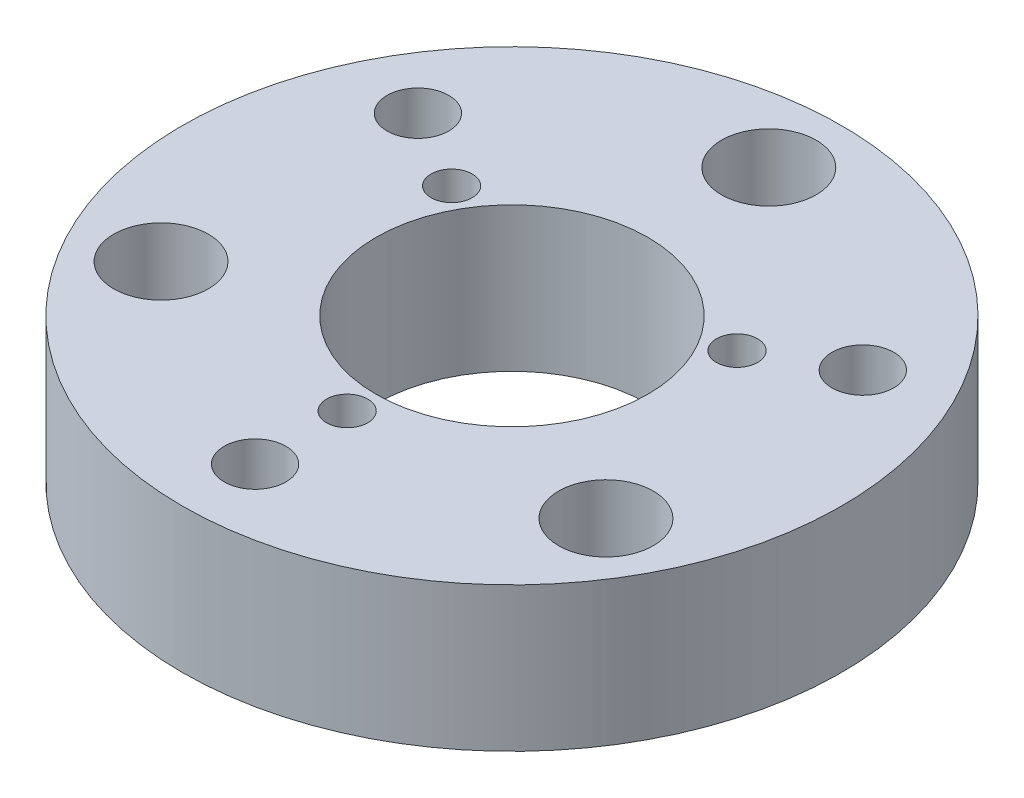
ISO-10303-21;
HEADER;
FILE_DESCRIPTION(('STEP AP214'),'2;1');
FILE_NAME('part.step','',(''),(''),'','','');
FILE_SCHEMA(('AUTOMOTIVE_DESIGN { 1 0 10303 214 1 1 1 1 }'));
ENDSEC;
DATA;
#1=APPLICATION_CONTEXT('core data for automotive mechanical design processes');
#2=APPLICATION_PROTOCOL_DEFINITION('international standard','automotive_design',2000,#1);
#3=PRODUCT_CONTEXT('',#1,'mechanical');
#4=PRODUCT('Part','Part','',(#3));
#5=PRODUCT_RELATED_PRODUCT_CATEGORY('part','',(#4));
#6=PRODUCT_DEFINITION_FORMATION('','',#4);
#7=PRODUCT_DEFINITION_CONTEXT('part definition',#1,'design');
#8=PRODUCT_DEFINITION('design','',#6,#7);
#9=PRODUCT_DEFINITION_SHAPE('','',#8);
#10=(LENGTH_UNIT() NAMED_UNIT(*) SI_UNIT(.MILLI.,.METRE.));
#11=(NAMED_UNIT(*) PLANE_ANGLE_UNIT() SI_UNIT($,.RADIAN.));
#12=(NAMED_UNIT(*) SI_UNIT($,.STERADIAN.) SOLID_ANGLE_UNIT());
#13=UNCERTAINTY_MEASURE_WITH_UNIT(LENGTH_MEASURE(1.E-05),#10,'distance_accuracy_value','');
#14=(GEOMETRIC_REPRESENTATION_CONTEXT(3) GLOBAL_UNCERTAINTY_ASSIGNED_CONTEXT((#13)) GLOBAL_UNIT_ASSIGNED_CONTEXT((#10,
#11,#12)) REPRESENTATION_CONTEXT('',''));
#15=CARTESIAN_POINT('',(0.,0.,0.));
#16=DIRECTION('',(0.,0.,1.));
#17=DIRECTION('',(1.,0.,0.));
#18=AXIS2_PLACEMENT_3D('',#15,#16,#17);
#19=CARTESIAN_POINT('',(0.,0.,24.9415316289918));
#20=DIRECTION('',(0.,1.,0.));
#21=DIRECTION('',(0.,0.,1.));
#22=AXIS2_PLACEMENT_3D('',#19,#20,#21);
#23=CYLINDRICAL_SURFACE('',#22,1.5);
#24=CARTESIAN_POINT('',(0.,7.,24.9415316289918));
#25=DIRECTION('',(0.,1.,0.));
#26=DIRECTION('',(0.,0.,1.));
#27=AXIS2_PLACEMENT_3D('',#24,#25,#26);
#28=CIRCLE('',#27,1.5);
#29=CARTESIAN_POINT('',(0.,7.,26.4415316289918));
#30=VERTEX_POINT('',#29);
#31=EDGE_CURVE('E92',#30,#30,#28,.T.);
#32=ORIENTED_EDGE('',*,*,#31,.T.);
#33=EDGE_LOOP('',(#32));
#34=FACE_BOUND('',#33,.T.);
#35=CARTESIAN_POINT('',(0.,4.,24.9415316289918));
#36=DIRECTION('',(0.,-1.,0.));
#37=DIRECTION('',(0.,0.,-1.));
#38=AXIS2_PLACEMENT_3D('',#35,#36,#37);
#39=CIRCLE('',#38,1.5);
#40=CARTESIAN_POINT('',(0.,4.,23.4415316289918));
#41=VERTEX_POINT('',#40);
#42=EDGE_CURVE('E44',#41,#41,#39,.F.);
#43=ORIENTED_EDGE('',*,*,#42,.F.);
#44=EDGE_LOOP('',(#43));
#45=FACE_BOUND('',#44,.T.);
#46=ADVANCED_FACE('F40',(#34,#45),#23,.F.);
#47=CARTESIAN_POINT('',(10.8,0.,6.23538290724796));
#48=DIRECTION('',(0.,1.,0.));
#49=DIRECTION('',(0.,0.,1.));
#50=AXIS2_PLACEMENT_3D('',#47,#48,#49);
#51=CYLINDRICAL_SURFACE('',#50,1.5);
#52=CARTESIAN_POINT('',(10.8,7.,6.23538290724796));
#53=DIRECTION('',(0.,1.,0.));
#54=DIRECTION('',(0.,0.,1.));
#55=AXIS2_PLACEMENT_3D('',#52,#53,#54);
#56=CIRCLE('',#55,1.5);
#57=CARTESIAN_POINT('',(10.8,7.,7.73538290724796));
#58=VERTEX_POINT('',#57);
#59=EDGE_CURVE('E99',#58,#58,#56,.T.);
#60=ORIENTED_EDGE('',*,*,#59,.T.);
#61=EDGE_LOOP('',(#60));
#62=FACE_BOUND('',#61,.T.);
#63=CARTESIAN_POINT('',(10.8,4.,6.23538290724796));
#64=DIRECTION('',(0.,-1.,0.));
#65=DIRECTION('',(0.,0.,-1.));
#66=AXIS2_PLACEMENT_3D('',#63,#64,#65);
#67=CIRCLE('',#66,1.5);
#68=CARTESIAN_POINT('',(10.8,4.,4.73538290724796));
#69=VERTEX_POINT('',#68);
#70=EDGE_CURVE('E81',#69,#69,#67,.F.);
#71=ORIENTED_EDGE('',*,*,#70,.F.);
#72=EDGE_LOOP('',(#71));
#73=FACE_BOUND('',#72,.T.);
#74=ADVANCED_FACE('F192',(#62,#73),#51,.F.);
#75=CARTESIAN_POINT('',(-10.8,0.,6.23538290724796));
#76=DIRECTION('',(0.,1.,0.));
#77=DIRECTION('',(0.,0.,1.));
#78=AXIS2_PLACEMENT_3D('',#75,#76,#77);
#79=CYLINDRICAL_SURFACE('',#78,1.5);
#80=CARTESIAN_POINT('',(-10.8,7.,6.23538290724796));
#81=DIRECTION('',(0.,1.,0.));
#82=DIRECTION('',(0.,0.,1.));
#83=AXIS2_PLACEMENT_3D('',#80,#81,#82);
#84=CIRCLE('',#83,1.5);
#85=CARTESIAN_POINT('',(-10.8,7.,7.73538290724796));
#86=VERTEX_POINT('',#85);
#87=EDGE_CURVE('E108',#86,#86,#84,.T.);
#88=ORIENTED_EDGE('',*,*,#87,.T.);
#89=EDGE_LOOP('',(#88));
#90=FACE_BOUND('',#89,.T.);
#91=CARTESIAN_POINT('',(-10.8,4.,6.23538290724796));
#92=DIRECTION('',(0.,-1.,0.));
#93=DIRECTION('',(0.,0.,-1.));
#94=AXIS2_PLACEMENT_3D('',#91,#92,#93);
#95=CIRCLE('',#94,1.5);
#96=CARTESIAN_POINT('',(-10.8,4.,4.73538290724796));
#97=VERTEX_POINT('',#96);
#98=EDGE_CURVE('E78',#97,#97,#95,.F.);
#99=ORIENTED_EDGE('',*,*,#98,.F.);
#100=EDGE_LOOP('',(#99));
#101=FACE_BOUND('',#100,.T.);
#102=ADVANCED_FACE('F197',(#90,#101),#79,.F.);
#103=CARTESIAN_POINT('',(-10.8,7.,18.7061487217439));
#104=DIRECTION('',(0.,-1.,0.));
#105=DIRECTION('',(0.,0.,-1.));
#106=AXIS2_PLACEMENT_3D('',#103,#104,#105);
#107=CYLINDRICAL_SURFACE('',#106,1.3);
#108=CARTESIAN_POINT('',(-10.8,0.,18.7061487217439));
#109=DIRECTION('',(0.,1.,0.));
#110=DIRECTION('',(0.,0.,1.));
#111=AXIS2_PLACEMENT_3D('',#108,#109,#110);
#112=CIRCLE('',#111,1.3);
#113=CARTESIAN_POINT('',(-10.8,0.,20.0061487217439));
#114=VERTEX_POINT('',#113);
#115=EDGE_CURVE('E161',#114,#114,#112,.T.);
#116=ORIENTED_EDGE('',*,*,#115,.F.);
#117=EDGE_LOOP('',(#116));
#118=FACE_BOUND('',#117,.T.);
#119=CARTESIAN_POINT('',(-10.8,2.,18.7061487217439));
#120=DIRECTION('',(0.,1.,0.));
#121=DIRECTION('',(0.,0.,1.));
#122=AXIS2_PLACEMENT_3D('',#119,#120,#121);
#123=CIRCLE('',#122,1.3);
#124=CARTESIAN_POINT('',(-10.8,2.,20.0061487217439));
#125=VERTEX_POINT('',#124);
#126=EDGE_CURVE('E73',#125,#125,#123,.T.);
#127=ORIENTED_EDGE('',*,*,#126,.T.);
#128=EDGE_LOOP('',(#127));
#129=FACE_BOUND('',#128,.T.);
#130=ADVANCED_FACE('F254',(#118,#129),#107,.F.);
#131=CARTESIAN_POINT('',(10.8,7.,18.7061487217439));
#132=DIRECTION('',(0.,-1.,0.));
#133=DIRECTION('',(0.,0.,-1.));
#134=AXIS2_PLACEMENT_3D('',#131,#132,#133);
#135=CYLINDRICAL_SURFACE('',#134,1.3);
#136=CARTESIAN_POINT('',(10.8,0.,18.7061487217439));
#137=DIRECTION('',(0.,1.,0.));
#138=DIRECTION('',(0.,0.,1.));
#139=AXIS2_PLACEMENT_3D('',#136,#137,#138);
#140=CIRCLE('',#139,1.3);
#141=CARTESIAN_POINT('',(10.8,0.,20.0061487217439));
#142=VERTEX_POINT('',#141);
#143=EDGE_CURVE('E158',#142,#142,#140,.T.);
#144=ORIENTED_EDGE('',*,*,#143,.F.);
#145=EDGE_LOOP('',(#144));
#146=FACE_BOUND('',#145,.T.);
#147=CARTESIAN_POINT('',(10.8,2.,18.7061487217439));
#148=DIRECTION('',(0.,1.,0.));
#149=DIRECTION('',(0.,0.,1.));
#150=AXIS2_PLACEMENT_3D('',#147,#148,#149);
#151=CIRCLE('',#150,1.3);
#152=CARTESIAN_POINT('',(10.8,2.,20.0061487217439));
#153=VERTEX_POINT('',#152);
#154=EDGE_CURVE('E68',#153,#153,#151,.T.);
#155=ORIENTED_EDGE('',*,*,#154,.T.);
#156=EDGE_LOOP('',(#155));
#157=FACE_BOUND('',#156,.T.);
#158=ADVANCED_FACE('F251',(#146,#157),#135,.F.);
#159=CARTESIAN_POINT('',(0.,7.,0.));
#160=DIRECTION('',(0.,-1.,0.));
#161=DIRECTION('',(0.,0.,-1.));
#162=AXIS2_PLACEMENT_3D('',#159,#160,#161);
#163=CYLINDRICAL_SURFACE('',#162,1.3);
#164=CARTESIAN_POINT('',(0.,0.,0.));
#165=DIRECTION('',(0.,1.,0.));
#166=DIRECTION('',(0.,0.,1.));
#167=AXIS2_PLACEMENT_3D('',#164,#165,#166);
#168=CIRCLE('',#167,1.3);
#169=CARTESIAN_POINT('',(0.,0.,1.3));
#170=VERTEX_POINT('',#169);
#171=EDGE_CURVE('E77',#170,#170,#168,.T.);
#172=ORIENTED_EDGE('',*,*,#171,.F.);
#173=EDGE_LOOP('',(#172));
#174=FACE_BOUND('',#173,.T.);
#175=CARTESIAN_POINT('',(0.,2.,0.));
#176=DIRECTION('',(0.,1.,0.));
#177=DIRECTION('',(0.,0.,1.));
#178=AXIS2_PLACEMENT_3D('',#175,#176,#177);
#179=CIRCLE('',#178,1.3);
#180=CARTESIAN_POINT('',(0.,2.,1.3));
#181=VERTEX_POINT('',#180);
#182=EDGE_CURVE('E64',#181,#181,#179,.T.);
#183=ORIENTED_EDGE('',*,*,#182,.T.);
#184=EDGE_LOOP('',(#183));
#185=FACE_BOUND('',#184,.T.);
#186=ADVANCED_FACE('F247',(#174,#185),#163,.F.);
#187=CARTESIAN_POINT('',(0.,7.,12.4707658144959));
#188=DIRECTION('',(0.,1.,0.));
#189=DIRECTION('',(0.,0.,1.));
#190=AXIS2_PLACEMENT_3D('',#187,#188,#189);
#191=PLANE('',#190);
#192=ORIENTED_EDGE('',*,*,#87,.F.);
#193=EDGE_LOOP('',(#192));
#194=FACE_BOUND('',#193,.T.);
#195=ORIENTED_EDGE('',*,*,#59,.F.);
#196=EDGE_LOOP('',(#195));
#197=FACE_BOUND('',#196,.T.);
#198=ORIENTED_EDGE('',*,*,#31,.F.);
#199=EDGE_LOOP('',(#198));
#200=FACE_BOUND('',#199,.T.);
#201=CARTESIAN_POINT('',(-6.9282032302755,7.,8.47076581449592));
#202=DIRECTION('',(0.,1.,0.));
#203=DIRECTION('',(0.,0.,1.));
#204=AXIS2_PLACEMENT_3D('',#201,#202,#203);
#205=CIRCLE('',#204,1.);
#206=CARTESIAN_POINT('',(-6.9282032302755,7.,9.47076581449592));
#207=VERTEX_POINT('',#206);
#208=EDGE_CURVE('E117',#207,#207,#205,.T.);
#209=ORIENTED_EDGE('',*,*,#208,.F.);
#210=EDGE_LOOP('',(#209));
#211=FACE_BOUND('',#210,.T.);
#212=CARTESIAN_POINT('',(6.92820323027551,7.,8.47076581449592));
#213=DIRECTION('',(0.,1.,0.));
#214=DIRECTION('',(0.,0.,-1.));
#215=AXIS2_PLACEMENT_3D('',#212,#213,#214);
#216=CIRCLE('',#215,1.);
#217=CARTESIAN_POINT('',(6.92820323027551,7.,7.47076581449592));
#218=VERTEX_POINT('',#217);
#219=EDGE_CURVE('E125',#218,#218,#216,.T.);
#220=ORIENTED_EDGE('',*,*,#219,.F.);
#221=EDGE_LOOP('',(#220));
#222=FACE_BOUND('',#221,.T.);
#223=CARTESIAN_POINT('',(0.,7.,20.4707658144959));
#224=DIRECTION('',(0.,1.,0.));
#225=DIRECTION('',(0.,0.,1.));
#226=AXIS2_PLACEMENT_3D('',#223,#224,#225);
#227=CIRCLE('',#226,1.);
#228=CARTESIAN_POINT('',(0.,7.,21.4707658144959));
#229=VERTEX_POINT('',#228);
#230=EDGE_CURVE('E132',#229,#229,#227,.T.);
#231=ORIENTED_EDGE('',*,*,#230,.F.);
#232=EDGE_LOOP('',(#231));
#233=FACE_BOUND('',#232,.T.);
#234=CARTESIAN_POINT('',(-10.8,7.,18.7061487217439));
#235=DIRECTION('',(0.,1.,0.));
#236=DIRECTION('',(0.,0.,1.));
#237=AXIS2_PLACEMENT_3D('',#234,#235,#236);
#238=CIRCLE('',#237,2.3);
#239=CARTESIAN_POINT('',(-10.8,7.,21.0061487217439));
#240=VERTEX_POINT('',#239);
#241=EDGE_CURVE('E137',#240,#240,#238,.T.);
#242=ORIENTED_EDGE('',*,*,#241,.F.);
#243=EDGE_LOOP('',(#242));
#244=FACE_BOUND('',#243,.T.);
#245=CARTESIAN_POINT('',(10.8,7.,18.7061487217439));
#246=DIRECTION('',(0.,1.,0.));
#247=DIRECTION('',(0.,0.,1.));
#248=AXIS2_PLACEMENT_3D('',#245,#246,#247);
#249=CIRCLE('',#248,2.3);
#250=CARTESIAN_POINT('',(10.8,7.,21.0061487217439));
#251=VERTEX_POINT('',#250);
#252=EDGE_CURVE('E145',#251,#251,#249,.T.);
#253=ORIENTED_EDGE('',*,*,#252,.F.);
#254=EDGE_LOOP('',(#253));
#255=FACE_BOUND('',#254,.T.);
#256=CARTESIAN_POINT('',(0.,7.,0.));
#257=DIRECTION('',(0.,1.,0.));
#258=DIRECTION('',(0.,0.,1.));
#259=AXIS2_PLACEMENT_3D('',#256,#257,#258);
#260=CIRCLE('',#259,2.3);
#261=CARTESIAN_POINT('',(0.,7.,2.3));
#262=VERTEX_POINT('',#261);
#263=EDGE_CURVE('E116',#262,#262,#260,.T.);
#264=ORIENTED_EDGE('',*,*,#263,.F.);
#265=EDGE_LOOP('',(#264));
#266=FACE_BOUND('',#265,.T.);
#267=CARTESIAN_POINT('',(0.,7.,12.4707658144959));
#268=DIRECTION('',(0.,1.,0.));
#269=DIRECTION('',(0.,0.,1.));
#270=AXIS2_PLACEMENT_3D('',#267,#268,#269);
#271=CIRCLE('',#270,6.6);
#272=CARTESIAN_POINT('',(0.,7.,19.0707658144959));
#273=VERTEX_POINT('',#272);
#274=EDGE_CURVE('E58',#273,#273,#271,.T.);
#275=ORIENTED_EDGE('',*,*,#274,.F.);
#276=EDGE_LOOP('',(#275));
#277=FACE_BOUND('',#276,.T.);
#278=CARTESIAN_POINT('',(0.,7.,12.4707658144959));
#279=DIRECTION('',(0.,1.,0.));
#280=DIRECTION('',(0.,0.,1.));
#281=AXIS2_PLACEMENT_3D('',#278,#279,#280);
#282=CIRCLE('',#281,16.);
#283=CARTESIAN_POINT('',(0.,7.,28.4707658144959));
#284=VERTEX_POINT('',#283);
#285=EDGE_CURVE('E10',#284,#284,#282,.T.);
#286=ORIENTED_EDGE('',*,*,#285,.T.);
#287=EDGE_LOOP('',(#286));
#288=FACE_BOUND('',#287,.T.);
#289=ADVANCED_FACE('F250',(#194,#197,#200,#211,#222,#233,#244,#255,#266,#277,#288),#191,.T.);
#290=CARTESIAN_POINT('',(0.,0.,12.4707658144959));
#291=DIRECTION('',(0.,1.,0.));
#292=DIRECTION('',(0.,0.,1.));
#293=AXIS2_PLACEMENT_3D('',#290,#291,#292);
#294=PLANE('',#293);
#295=CARTESIAN_POINT('',(0.,0.,24.9415316289918));
#296=DIRECTION('',(0.,-1.,0.));
#297=DIRECTION('',(0.,0.,-1.));
#298=AXIS2_PLACEMENT_3D('',#295,#296,#297);
#299=CIRCLE('',#298,2.65);
#300=CARTESIAN_POINT('',(0.,0.,22.2915316289918));
#301=VERTEX_POINT('',#300);
#302=EDGE_CURVE('E317',#301,#301,#299,.T.);
#303=ORIENTED_EDGE('',*,*,#302,.F.);
#304=EDGE_LOOP('',(#303));
#305=FACE_BOUND('',#304,.T.);
#306=CARTESIAN_POINT('',(-10.8,0.,6.23538290724796));
#307=DIRECTION('',(0.,-1.,0.));
#308=DIRECTION('',(0.,0.,-1.));
#309=AXIS2_PLACEMENT_3D('',#306,#307,#308);
#310=CIRCLE('',#309,2.65);
#311=CARTESIAN_POINT('',(-10.8,0.,3.58538290724796));
#312=VERTEX_POINT('',#311);
#313=EDGE_CURVE('E309',#312,#312,#310,.T.);
#314=ORIENTED_EDGE('',*,*,#313,.F.);
#315=EDGE_LOOP('',(#314));
#316=FACE_BOUND('',#315,.T.);
#317=CARTESIAN_POINT('',(10.8,0.,6.23538290724796));
#318=DIRECTION('',(0.,-1.,0.));
#319=DIRECTION('',(0.,0.,-1.));
#320=AXIS2_PLACEMENT_3D('',#317,#318,#319);
#321=CIRCLE('',#320,2.65);
#322=CARTESIAN_POINT('',(10.8,0.,3.58538290724796));
#323=VERTEX_POINT('',#322);
#324=EDGE_CURVE('E301',#323,#323,#321,.T.);
#325=ORIENTED_EDGE('',*,*,#324,.F.);
#326=EDGE_LOOP('',(#325));
#327=FACE_BOUND('',#326,.T.);
#328=CARTESIAN_POINT('',(0.,0.,12.4707658144959));
#329=DIRECTION('',(0.,1.,0.));
#330=DIRECTION('',(0.,0.,1.));
#331=AXIS2_PLACEMENT_3D('',#328,#329,#330);
#332=CIRCLE('',#331,16.);
#333=CARTESIAN_POINT('',(0.,0.,28.4707658144959));
#334=VERTEX_POINT('',#333);
#335=EDGE_CURVE('E49',#334,#334,#332,.T.);
#336=ORIENTED_EDGE('',*,*,#335,.F.);
#337=EDGE_LOOP('',(#336));
#338=FACE_BOUND('',#337,.T.);
#339=CARTESIAN_POINT('',(0.,0.,12.4707658144959));
#340=DIRECTION('',(0.,1.,0.));
#341=DIRECTION('',(0.,0.,1.));
#342=AXIS2_PLACEMENT_3D('',#339,#340,#341);
#343=CIRCLE('',#342,6.6);
#344=CARTESIAN_POINT('',(0.,0.,19.0707658144959));
#345=VERTEX_POINT('',#344);
#346=EDGE_CURVE('E61',#345,#345,#343,.T.);
#347=ORIENTED_EDGE('',*,*,#346,.T.);
#348=EDGE_LOOP('',(#347));
#349=FACE_BOUND('',#348,.T.);
#350=ORIENTED_EDGE('',*,*,#115,.T.);
#351=EDGE_LOOP('',(#350));
#352=FACE_BOUND('',#351,.T.);
#353=ORIENTED_EDGE('',*,*,#143,.T.);
#354=EDGE_LOOP('',(#353));
#355=FACE_BOUND('',#354,.T.);
#356=ORIENTED_EDGE('',*,*,#171,.T.);
#357=EDGE_LOOP('',(#356));
#358=FACE_BOUND('',#357,.T.);
#359=ADVANCED_FACE('F174',(#305,#316,#327,#338,#349,#352,#355,#358),#294,.F.);
#360=CARTESIAN_POINT('',(0.,7.,12.4707658144959));
#361=DIRECTION('',(0.,-1.,0.));
#362=DIRECTION('',(0.,0.,-1.));
#363=AXIS2_PLACEMENT_3D('',#360,#361,#362);
#364=CYLINDRICAL_SURFACE('',#363,16.);
#365=ORIENTED_EDGE('',*,*,#285,.F.);
#366=EDGE_LOOP('',(#365));
#367=FACE_BOUND('',#366,.T.);
#368=ORIENTED_EDGE('',*,*,#335,.T.);
#369=EDGE_LOOP('',(#368));
#370=FACE_BOUND('',#369,.T.);
#371=ADVANCED_FACE('F42',(#367,#370),#364,.T.);
#372=CARTESIAN_POINT('',(0.,7.,12.4707658144959));
#373=DIRECTION('',(0.,-1.,0.));
#374=DIRECTION('',(0.,0.,-1.));
#375=AXIS2_PLACEMENT_3D('',#372,#373,#374);
#376=CYLINDRICAL_SURFACE('',#375,6.6);
#377=ORIENTED_EDGE('',*,*,#274,.T.);
#378=EDGE_LOOP('',(#377));
#379=FACE_BOUND('',#378,.T.);
#380=ORIENTED_EDGE('',*,*,#346,.F.);
#381=EDGE_LOOP('',(#380));
#382=FACE_BOUND('',#381,.T.);
#383=ADVANCED_FACE('F177',(#379,#382),#376,.F.);
#384=CARTESIAN_POINT('',(0.,2.,0.));
#385=DIRECTION('',(0.,1.,0.));
#386=DIRECTION('',(0.,0.,1.));
#387=AXIS2_PLACEMENT_3D('',#384,#385,#386);
#388=CYLINDRICAL_SURFACE('',#387,2.3);
#389=CARTESIAN_POINT('',(0.,2.,0.));
#390=DIRECTION('',(0.,1.,0.));
#391=DIRECTION('',(0.,0.,1.));
#392=AXIS2_PLACEMENT_3D('',#389,#390,#391);
#393=CIRCLE('',#392,2.3);
#394=CARTESIAN_POINT('',(0.,2.,2.3));
#395=VERTEX_POINT('',#394);
#396=EDGE_CURVE('E149',#395,#395,#393,.T.);
#397=ORIENTED_EDGE('',*,*,#396,.F.);
#398=EDGE_LOOP('',(#397));
#399=FACE_BOUND('',#398,.T.);
#400=ORIENTED_EDGE('',*,*,#263,.T.);
#401=EDGE_LOOP('',(#400));
#402=FACE_BOUND('',#401,.T.);
#403=ADVANCED_FACE('F179',(#399,#402),#388,.F.);
#404=CARTESIAN_POINT('',(0.,2.,0.));
#405=DIRECTION('',(0.,1.,0.));
#406=DIRECTION('',(0.,0.,1.));
#407=AXIS2_PLACEMENT_3D('',#404,#405,#406);
#408=PLANE('',#407);
#409=ORIENTED_EDGE('',*,*,#182,.F.);
#410=EDGE_LOOP('',(#409));
#411=FACE_BOUND('',#410,.T.);
#412=ORIENTED_EDGE('',*,*,#396,.T.);
#413=EDGE_LOOP('',(#412));
#414=FACE_BOUND('',#413,.T.);
#415=ADVANCED_FACE('F185',(#411,#414),#408,.T.);
#416=CARTESIAN_POINT('',(10.8,2.,18.7061487217439));
#417=DIRECTION('',(0.,1.,0.));
#418=DIRECTION('',(0.,0.,1.));
#419=AXIS2_PLACEMENT_3D('',#416,#417,#418);
#420=CYLINDRICAL_SURFACE('',#419,2.3);
#421=CARTESIAN_POINT('',(10.8,2.,18.7061487217439));
#422=DIRECTION('',(0.,1.,0.));
#423=DIRECTION('',(0.,0.,1.));
#424=AXIS2_PLACEMENT_3D('',#421,#422,#423);
#425=CIRCLE('',#424,2.3);
#426=CARTESIAN_POINT('',(10.8,2.,21.0061487217439));
#427=VERTEX_POINT('',#426);
#428=EDGE_CURVE('E141',#427,#427,#425,.T.);
#429=ORIENTED_EDGE('',*,*,#428,.F.);
#430=EDGE_LOOP('',(#429));
#431=FACE_BOUND('',#430,.T.);
#432=ORIENTED_EDGE('',*,*,#252,.T.);
#433=EDGE_LOOP('',(#432));
#434=FACE_BOUND('',#433,.T.);
#435=ADVANCED_FACE('F239',(#431,#434),#420,.F.);
#436=CARTESIAN_POINT('',(10.8,2.,18.7061487217439));
#437=DIRECTION('',(0.,1.,0.));
#438=DIRECTION('',(0.,0.,1.));
#439=AXIS2_PLACEMENT_3D('',#436,#437,#438);
#440=PLANE('',#439);
#441=ORIENTED_EDGE('',*,*,#154,.F.);
#442=EDGE_LOOP('',(#441));
#443=FACE_BOUND('',#442,.T.);
#444=ORIENTED_EDGE('',*,*,#428,.T.);
#445=EDGE_LOOP('',(#444));
#446=FACE_BOUND('',#445,.T.);
#447=ADVANCED_FACE('F235',(#443,#446),#440,.T.);
#448=CARTESIAN_POINT('',(-10.8,2.,18.7061487217439));
#449=DIRECTION('',(0.,1.,0.));
#450=DIRECTION('',(0.,0.,1.));
#451=AXIS2_PLACEMENT_3D('',#448,#449,#450);
#452=CYLINDRICAL_SURFACE('',#451,2.3);
#453=CARTESIAN_POINT('',(-10.8,2.,18.7061487217439));
#454=DIRECTION('',(0.,1.,0.));
#455=DIRECTION('',(0.,0.,1.));
#456=AXIS2_PLACEMENT_3D('',#453,#454,#455);
#457=CIRCLE('',#456,2.3);
#458=CARTESIAN_POINT('',(-10.8,2.,21.0061487217439));
#459=VERTEX_POINT('',#458);
#460=EDGE_CURVE('E69',#459,#459,#457,.T.);
#461=ORIENTED_EDGE('',*,*,#460,.F.);
#462=EDGE_LOOP('',(#461));
#463=FACE_BOUND('',#462,.T.);
#464=ORIENTED_EDGE('',*,*,#241,.T.);
#465=EDGE_LOOP('',(#464));
#466=FACE_BOUND('',#465,.T.);
#467=ADVANCED_FACE('F231',(#463,#466),#452,.F.);
#468=CARTESIAN_POINT('',(-10.8,2.,18.7061487217439));
#469=DIRECTION('',(0.,1.,0.));
#470=DIRECTION('',(0.,0.,1.));
#471=AXIS2_PLACEMENT_3D('',#468,#469,#470);
#472=PLANE('',#471);
#473=ORIENTED_EDGE('',*,*,#126,.F.);
#474=EDGE_LOOP('',(#473));
#475=FACE_BOUND('',#474,.T.);
#476=ORIENTED_EDGE('',*,*,#460,.T.);
#477=EDGE_LOOP('',(#476));
#478=FACE_BOUND('',#477,.T.);
#479=ADVANCED_FACE('F227',(#475,#478),#472,.T.);
#480=CARTESIAN_POINT('',(0.,5.,20.4707658144959));
#481=DIRECTION('',(0.,1.,0.));
#482=DIRECTION('',(0.,0.,1.));
#483=AXIS2_PLACEMENT_3D('',#480,#481,#482);
#484=CYLINDRICAL_SURFACE('',#483,1.);
#485=CARTESIAN_POINT('',(0.,5.,20.4707658144959));
#486=DIRECTION('',(0.,1.,0.));
#487=DIRECTION('',(0.,0.,1.));
#488=AXIS2_PLACEMENT_3D('',#485,#486,#487);
#489=CIRCLE('',#488,1.);
#490=CARTESIAN_POINT('',(0.,5.,21.4707658144959));
#491=VERTEX_POINT('',#490);
#492=EDGE_CURVE('E128',#491,#491,#489,.T.);
#493=ORIENTED_EDGE('',*,*,#492,.F.);
#494=EDGE_LOOP('',(#493));
#495=FACE_BOUND('',#494,.T.);
#496=ORIENTED_EDGE('',*,*,#230,.T.);
#497=EDGE_LOOP('',(#496));
#498=FACE_BOUND('',#497,.T.);
#499=ADVANCED_FACE('F223',(#495,#498),#484,.F.);
#500=CARTESIAN_POINT('',(0.,5.,20.4707658144959));
#501=DIRECTION('',(0.,1.,0.));
#502=DIRECTION('',(0.,0.,1.));
#503=AXIS2_PLACEMENT_3D('',#500,#501,#502);
#504=PLANE('',#503);
#505=ORIENTED_EDGE('',*,*,#492,.T.);
#506=EDGE_LOOP('',(#505));
#507=FACE_BOUND('',#506,.T.);
#508=ADVANCED_FACE('F219',(#507),#504,.T.);
#509=CARTESIAN_POINT('',(6.92820323027551,5.,8.47076581449592));
#510=DIRECTION('',(0.,1.,0.));
#511=DIRECTION('',(0.,0.,1.));
#512=AXIS2_PLACEMENT_3D('',#509,#510,#511);
#513=CYLINDRICAL_SURFACE('',#512,1.);
#514=CARTESIAN_POINT('',(6.92820323027551,5.,8.47076581449592));
#515=DIRECTION('',(0.,1.,0.));
#516=DIRECTION('',(0.,0.,-1.));
#517=AXIS2_PLACEMENT_3D('',#514,#515,#516);
#518=CIRCLE('',#517,1.);
#519=CARTESIAN_POINT('',(6.92820323027551,5.,7.47076581449592));
#520=VERTEX_POINT('',#519);
#521=EDGE_CURVE('E121',#520,#520,#518,.T.);
#522=ORIENTED_EDGE('',*,*,#521,.F.);
#523=EDGE_LOOP('',(#522));
#524=FACE_BOUND('',#523,.T.);
#525=ORIENTED_EDGE('',*,*,#219,.T.);
#526=EDGE_LOOP('',(#525));
#527=FACE_BOUND('',#526,.T.);
#528=ADVANCED_FACE('F215',(#524,#527),#513,.F.);
#529=CARTESIAN_POINT('',(6.92820323027551,5.,8.47076581449592));
#530=DIRECTION('',(0.,-1.,0.));
#531=DIRECTION('',(0.,0.,-1.));
#532=AXIS2_PLACEMENT_3D('',#529,#530,#531);
#533=PLANE('',#532);
#534=ORIENTED_EDGE('',*,*,#521,.T.);
#535=EDGE_LOOP('',(#534));
#536=FACE_BOUND('',#535,.T.);
#537=ADVANCED_FACE('F211',(#536),#533,.F.);
#538=CARTESIAN_POINT('',(-6.9282032302755,5.,8.47076581449592));
#539=DIRECTION('',(0.,1.,0.));
#540=DIRECTION('',(0.,0.,1.));
#541=AXIS2_PLACEMENT_3D('',#538,#539,#540);
#542=CYLINDRICAL_SURFACE('',#541,1.);
#543=CARTESIAN_POINT('',(-6.9282032302755,5.,8.47076581449592));
#544=DIRECTION('',(0.,1.,0.));
#545=DIRECTION('',(0.,0.,1.));
#546=AXIS2_PLACEMENT_3D('',#543,#544,#545);
#547=CIRCLE('',#546,1.);
#548=CARTESIAN_POINT('',(-6.9282032302755,5.,9.47076581449592));
#549=VERTEX_POINT('',#548);
#550=EDGE_CURVE('E112',#549,#549,#547,.T.);
#551=ORIENTED_EDGE('',*,*,#550,.F.);
#552=EDGE_LOOP('',(#551));
#553=FACE_BOUND('',#552,.T.);
#554=ORIENTED_EDGE('',*,*,#208,.T.);
#555=EDGE_LOOP('',(#554));
#556=FACE_BOUND('',#555,.T.);
#557=ADVANCED_FACE('F207',(#553,#556),#542,.F.);
#558=CARTESIAN_POINT('',(-6.9282032302755,5.,8.47076581449592));
#559=DIRECTION('',(0.,1.,0.));
#560=DIRECTION('',(0.,0.,1.));
#561=AXIS2_PLACEMENT_3D('',#558,#559,#560);
#562=PLANE('',#561);
#563=ORIENTED_EDGE('',*,*,#550,.T.);
#564=EDGE_LOOP('',(#563));
#565=FACE_BOUND('',#564,.T.);
#566=ADVANCED_FACE('F203',(#565),#562,.T.);
#567=CARTESIAN_POINT('',(-10.8,4.,6.23538290724796));
#568=DIRECTION('',(0.,-1.,0.));
#569=DIRECTION('',(0.,0.,-1.));
#570=AXIS2_PLACEMENT_3D('',#567,#568,#569);
#571=PLANE('',#570);
#572=CARTESIAN_POINT('',(-10.8,4.,6.23538290724796));
#573=DIRECTION('',(0.,-1.,0.));
#574=DIRECTION('',(0.,0.,-1.));
#575=AXIS2_PLACEMENT_3D('',#572,#573,#574);
#576=CIRCLE('',#575,2.65);
#577=CARTESIAN_POINT('',(-10.8,4.,3.58538290724796));
#578=VERTEX_POINT('',#577);
#579=EDGE_CURVE('E313',#578,#578,#576,.T.);
#580=ORIENTED_EDGE('',*,*,#579,.T.);
#581=EDGE_LOOP('',(#580));
#582=FACE_BOUND('',#581,.T.);
#583=ORIENTED_EDGE('',*,*,#98,.T.);
#584=EDGE_LOOP('',(#583));
#585=FACE_BOUND('',#584,.T.);
#586=ADVANCED_FACE('F206',(#582,#585),#571,.T.);
#587=CARTESIAN_POINT('',(-10.8,4.,6.23538290724796));
#588=DIRECTION('',(0.,-1.,0.));
#589=DIRECTION('',(0.,0.,-1.));
#590=AXIS2_PLACEMENT_3D('',#587,#588,#589);
#591=CYLINDRICAL_SURFACE('',#590,2.65);
#592=ORIENTED_EDGE('',*,*,#579,.F.);
#593=EDGE_LOOP('',(#592));
#594=FACE_BOUND('',#593,.T.);
#595=ORIENTED_EDGE('',*,*,#313,.T.);
#596=EDGE_LOOP('',(#595));
#597=FACE_BOUND('',#596,.T.);
#598=ADVANCED_FACE('F349',(#594,#597),#591,.F.);
#599=CARTESIAN_POINT('',(10.8,4.,6.23538290724796));
#600=DIRECTION('',(0.,-1.,0.));
#601=DIRECTION('',(0.,0.,-1.));
#602=AXIS2_PLACEMENT_3D('',#599,#600,#601);
#603=PLANE('',#602);
#604=CARTESIAN_POINT('',(10.8,4.,6.23538290724796));
#605=DIRECTION('',(0.,-1.,0.));
#606=DIRECTION('',(0.,0.,-1.));
#607=AXIS2_PLACEMENT_3D('',#604,#605,#606);
#608=CIRCLE('',#607,2.65);
#609=CARTESIAN_POINT('',(10.8,4.,3.58538290724796));
#610=VERTEX_POINT('',#609);
#611=EDGE_CURVE('E305',#610,#610,#608,.T.);
#612=ORIENTED_EDGE('',*,*,#611,.T.);
#613=EDGE_LOOP('',(#612));
#614=FACE_BOUND('',#613,.T.);
#615=ORIENTED_EDGE('',*,*,#70,.T.);
#616=EDGE_LOOP('',(#615));
#617=FACE_BOUND('',#616,.T.);
#618=ADVANCED_FACE('F341',(#614,#617),#603,.T.);
#619=CARTESIAN_POINT('',(10.8,4.,6.23538290724796));
#620=DIRECTION('',(0.,-1.,0.));
#621=DIRECTION('',(0.,0.,-1.));
#622=AXIS2_PLACEMENT_3D('',#619,#620,#621);
#623=CYLINDRICAL_SURFACE('',#622,2.65);
#624=ORIENTED_EDGE('',*,*,#611,.F.);
#625=EDGE_LOOP('',(#624));
#626=FACE_BOUND('',#625,.T.);
#627=ORIENTED_EDGE('',*,*,#324,.T.);
#628=EDGE_LOOP('',(#627));
#629=FACE_BOUND('',#628,.T.);
#630=ADVANCED_FACE('F339',(#626,#629),#623,.F.);
#631=CARTESIAN_POINT('',(0.,4.,24.9415316289918));
#632=DIRECTION('',(0.,-1.,0.));
#633=DIRECTION('',(0.,0.,-1.));
#634=AXIS2_PLACEMENT_3D('',#631,#632,#633);
#635=PLANE('',#634);
#636=CARTESIAN_POINT('',(0.,4.,24.9415316289918));
#637=DIRECTION('',(0.,-1.,0.));
#638=DIRECTION('',(0.,0.,-1.));
#639=AXIS2_PLACEMENT_3D('',#636,#637,#638);
#640=CIRCLE('',#639,2.65);
#641=CARTESIAN_POINT('',(0.,4.,22.2915316289918));
#642=VERTEX_POINT('',#641);
#643=EDGE_CURVE('E82',#642,#642,#640,.T.);
#644=ORIENTED_EDGE('',*,*,#643,.T.);
#645=EDGE_LOOP('',(#644));
#646=FACE_BOUND('',#645,.T.);
#647=ORIENTED_EDGE('',*,*,#42,.T.);
#648=EDGE_LOOP('',(#647));
#649=FACE_BOUND('',#648,.T.);
#650=ADVANCED_FACE('F324',(#646,#649),#635,.T.);
#651=CARTESIAN_POINT('',(0.,4.,24.9415316289918));
#652=DIRECTION('',(0.,-1.,0.));
#653=DIRECTION('',(0.,0.,-1.));
#654=AXIS2_PLACEMENT_3D('',#651,#652,#653);
#655=CYLINDRICAL_SURFACE('',#654,2.65);
#656=ORIENTED_EDGE('',*,*,#643,.F.);
#657=EDGE_LOOP('',(#656));
#658=FACE_BOUND('',#657,.T.);
#659=ORIENTED_EDGE('',*,*,#302,.T.);
#660=EDGE_LOOP('',(#659));
#661=FACE_BOUND('',#660,.T.);
#662=ADVANCED_FACE('F326',(#658,#661),#655,.F.);
#663=CLOSED_SHELL('',(#46,#74,#102,#130,#158,#186,#289,#359,#371,#383,#403,#415,#435,#447,#467,
#479,#499,#508,#528,#537,#557,#566,#586,#598,#618,#630,#650,#662));
#664=MANIFOLD_SOLID_BREP('B2',#663);
#665=ADVANCED_BREP_SHAPE_REPRESENTATION('',(#18,#664),#14);
#666=SHAPE_DEFINITION_REPRESENTATION(#9,#665);
ENDSEC;
END-ISO-10303-21;
